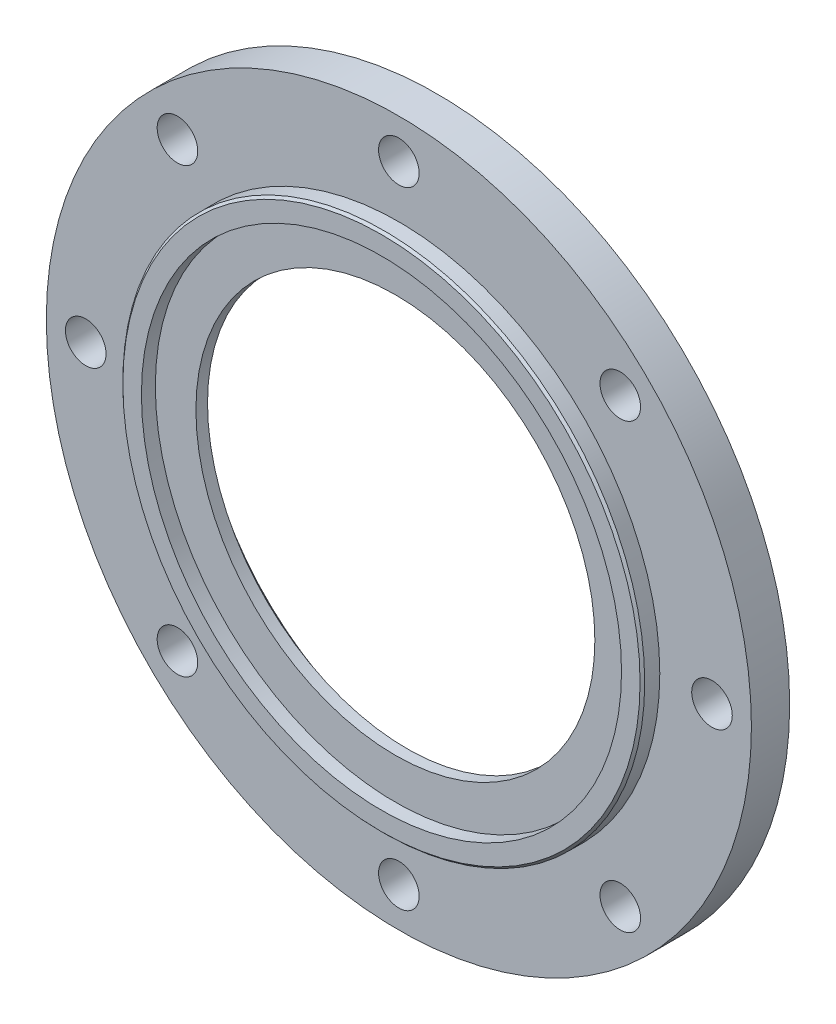
ISO-10303-21;
HEADER;
FILE_DESCRIPTION(('STEP AP214'),'2;1');
FILE_NAME('part.step','',(''),(''),'','','');
FILE_SCHEMA(('AUTOMOTIVE_DESIGN { 1 0 10303 214 1 1 1 1 }'));
ENDSEC;
DATA;
#1=APPLICATION_CONTEXT('core data for automotive mechanical design processes');
#2=APPLICATION_PROTOCOL_DEFINITION('international standard','automotive_design',2000,#1);
#3=PRODUCT_CONTEXT('',#1,'mechanical');
#4=PRODUCT('Part','Part','',(#3));
#5=PRODUCT_RELATED_PRODUCT_CATEGORY('part','',(#4));
#6=PRODUCT_DEFINITION_FORMATION('','',#4);
#7=PRODUCT_DEFINITION_CONTEXT('part definition',#1,'design');
#8=PRODUCT_DEFINITION('design','',#6,#7);
#9=PRODUCT_DEFINITION_SHAPE('','',#8);
#10=(LENGTH_UNIT() NAMED_UNIT(*) SI_UNIT(.MILLI.,.METRE.));
#11=(NAMED_UNIT(*) PLANE_ANGLE_UNIT() SI_UNIT($,.RADIAN.));
#12=(NAMED_UNIT(*) SI_UNIT($,.STERADIAN.) SOLID_ANGLE_UNIT());
#13=UNCERTAINTY_MEASURE_WITH_UNIT(LENGTH_MEASURE(1.E-05),#10,'distance_accuracy_value','');
#14=(GEOMETRIC_REPRESENTATION_CONTEXT(3) GLOBAL_UNCERTAINTY_ASSIGNED_CONTEXT((#13)) GLOBAL_UNIT_ASSIGNED_CONTEXT((#10,
#11,#12)) REPRESENTATION_CONTEXT('',''));
#15=CARTESIAN_POINT('',(0.,0.,0.));
#16=DIRECTION('',(0.,0.,1.));
#17=DIRECTION('',(1.,0.,0.));
#18=AXIS2_PLACEMENT_3D('',#15,#16,#17);
#19=CARTESIAN_POINT('',(0.,0.,24.));
#20=DIRECTION('',(0.,0.,-1.));
#21=DIRECTION('',(-1.,0.,0.));
#22=AXIS2_PLACEMENT_3D('',#19,#20,#21);
#23=CYLINDRICAL_SURFACE('',#22,86.);
#24=CARTESIAN_POINT('',(0.,0.,18.));
#25=DIRECTION('',(0.,0.,1.));
#26=DIRECTION('',(1.,0.,0.));
#27=AXIS2_PLACEMENT_3D('',#24,#25,#26);
#28=CIRCLE('',#27,86.);
#29=CARTESIAN_POINT('',(86.,0.,18.));
#30=VERTEX_POINT('',#29);
#31=EDGE_CURVE('E177',#30,#30,#28,.T.);
#32=ORIENTED_EDGE('',*,*,#31,.T.);
#33=EDGE_LOOP('',(#32));
#34=FACE_BOUND('',#33,.T.);
#35=CARTESIAN_POINT('',(0.,0.,13.));
#36=DIRECTION('',(0.,0.,-1.));
#37=DIRECTION('',(-1.,0.,0.));
#38=AXIS2_PLACEMENT_3D('',#35,#36,#37);
#39=CIRCLE('',#38,86.);
#40=CARTESIAN_POINT('',(-86.,0.,13.));
#41=VERTEX_POINT('',#40);
#42=EDGE_CURVE('E163',#41,#41,#39,.T.);
#43=ORIENTED_EDGE('',*,*,#42,.T.);
#44=EDGE_LOOP('',(#43));
#45=FACE_BOUND('',#44,.T.);
#46=ADVANCED_FACE('F49',(#34,#45),#23,.F.);
#47=CARTESIAN_POINT('',(0.,0.,24.));
#48=DIRECTION('',(0.,0.,1.));
#49=DIRECTION('',(1.,0.,0.));
#50=AXIS2_PLACEMENT_3D('',#47,#48,#49);
#51=PLANE('',#50);
#52=CARTESIAN_POINT('',(0.,0.,24.));
#53=DIRECTION('',(0.,0.,1.));
#54=DIRECTION('',(1.,0.,0.));
#55=AXIS2_PLACEMENT_3D('',#52,#53,#54);
#56=CIRCLE('',#55,111.5);
#57=CARTESIAN_POINT('',(111.5,0.,24.));
#58=VERTEX_POINT('',#57);
#59=EDGE_CURVE('E193',#58,#58,#56,.T.);
#60=ORIENTED_EDGE('',*,*,#59,.T.);
#61=EDGE_LOOP('',(#60));
#62=FACE_BOUND('',#61,.T.);
#63=CARTESIAN_POINT('',(0.,0.,24.));
#64=DIRECTION('',(0.,0.,1.));
#65=DIRECTION('',(1.,0.,0.));
#66=AXIS2_PLACEMENT_3D('',#63,#64,#65);
#67=CIRCLE('',#66,103.5);
#68=CARTESIAN_POINT('',(103.5,0.,24.));
#69=VERTEX_POINT('',#68);
#70=EDGE_CURVE('E168',#69,#69,#67,.T.);
#71=ORIENTED_EDGE('',*,*,#70,.F.);
#72=EDGE_LOOP('',(#71));
#73=FACE_BOUND('',#72,.T.);
#74=ADVANCED_FACE('F225',(#62,#73),#51,.T.);
#75=CARTESIAN_POINT('',(0.,0.,24.));
#76=DIRECTION('',(0.,0.,-1.));
#77=DIRECTION('',(-1.,0.,0.));
#78=AXIS2_PLACEMENT_3D('',#75,#76,#77);
#79=CYLINDRICAL_SURFACE('',#78,152.);
#80=CARTESIAN_POINT('',(0.,0.,0.));
#81=DIRECTION('',(0.,0.,1.));
#82=DIRECTION('',(1.,0.,0.));
#83=AXIS2_PLACEMENT_3D('',#80,#81,#82);
#84=CIRCLE('',#83,152.);
#85=CARTESIAN_POINT('',(152.,0.,0.));
#86=VERTEX_POINT('',#85);
#87=EDGE_CURVE('E189',#86,#86,#84,.T.);
#88=ORIENTED_EDGE('',*,*,#87,.T.);
#89=EDGE_LOOP('',(#88));
#90=FACE_BOUND('',#89,.T.);
#91=CARTESIAN_POINT('',(0.,0.,16.5));
#92=DIRECTION('',(0.,0.,1.));
#93=DIRECTION('',(1.,0.,0.));
#94=AXIS2_PLACEMENT_3D('',#91,#92,#93);
#95=CIRCLE('',#94,152.);
#96=CARTESIAN_POINT('',(152.,0.,16.5));
#97=VERTEX_POINT('',#96);
#98=EDGE_CURVE('E185',#97,#97,#95,.T.);
#99=ORIENTED_EDGE('',*,*,#98,.F.);
#100=EDGE_LOOP('',(#99));
#101=FACE_BOUND('',#100,.T.);
#102=ADVANCED_FACE('F231',(#90,#101),#79,.T.);
#103=CARTESIAN_POINT('',(0.,0.,0.));
#104=DIRECTION('',(0.,0.,1.));
#105=DIRECTION('',(1.,0.,0.));
#106=AXIS2_PLACEMENT_3D('',#103,#104,#105);
#107=PLANE('',#106);
#108=CARTESIAN_POINT('',(135.,-4.71349980743823E-13,0.));
#109=DIRECTION('',(0.,0.,-1.));
#110=DIRECTION('',(0.,1.,0.));
#111=AXIS2_PLACEMENT_3D('',#108,#109,#110);
#112=CIRCLE('',#111,8.75);
#113=CARTESIAN_POINT('',(135.,8.74999999999953,0.));
#114=VERTEX_POINT('',#113);
#115=EDGE_CURVE('E650',#114,#114,#112,.T.);
#116=ORIENTED_EDGE('',*,*,#115,.F.);
#117=EDGE_LOOP('',(#116));
#118=FACE_BOUND('',#117,.T.);
#119=CARTESIAN_POINT('',(95.4594154601834,-95.4594154601844,0.));
#120=DIRECTION('',(0.,0.,-1.));
#121=DIRECTION('',(0.707106781186551,0.707106781186544,0.));
#122=AXIS2_PLACEMENT_3D('',#119,#120,#121);
#123=CIRCLE('',#122,8.75);
#124=CARTESIAN_POINT('',(101.646599795566,-89.2722311248022,0.));
#125=VERTEX_POINT('',#124);
#126=EDGE_CURVE('E652',#125,#125,#123,.T.);
#127=ORIENTED_EDGE('',*,*,#126,.F.);
#128=EDGE_LOOP('',(#127));
#129=FACE_BOUND('',#128,.T.);
#130=CARTESIAN_POINT('',(0.,-135.,0.));
#131=DIRECTION('',(0.,0.,-1.));
#132=DIRECTION('',(1.,0.,0.));
#133=AXIS2_PLACEMENT_3D('',#130,#131,#132);
#134=CIRCLE('',#133,8.75);
#135=CARTESIAN_POINT('',(8.75,-135.,0.));
#136=VERTEX_POINT('',#135);
#137=EDGE_CURVE('E658',#136,#136,#134,.T.);
#138=ORIENTED_EDGE('',*,*,#137,.F.);
#139=EDGE_LOOP('',(#138));
#140=FACE_BOUND('',#139,.T.);
#141=CARTESIAN_POINT('',(-95.4594154601848,-95.4594154601831,0.));
#142=DIRECTION('',(0.,0.,-1.));
#143=DIRECTION('',(0.707106781186541,-0.707106781186554,0.));
#144=AXIS2_PLACEMENT_3D('',#141,#142,#143);
#145=CIRCLE('',#144,8.75);
#146=CARTESIAN_POINT('',(-89.2722311248025,-101.646599795565,0.));
#147=VERTEX_POINT('',#146);
#148=EDGE_CURVE('E666',#147,#147,#145,.T.);
#149=ORIENTED_EDGE('',*,*,#148,.F.);
#150=EDGE_LOOP('',(#149));
#151=FACE_BOUND('',#150,.T.);
#152=CARTESIAN_POINT('',(-135.,1.41404994223147E-12,0.));
#153=DIRECTION('',(0.,0.,-1.));
#154=DIRECTION('',(0.,-1.,0.));
#155=AXIS2_PLACEMENT_3D('',#152,#153,#154);
#156=CIRCLE('',#155,8.75);
#157=CARTESIAN_POINT('',(-135.,-8.74999999999859,0.));
#158=VERTEX_POINT('',#157);
#159=EDGE_CURVE('E669',#158,#158,#156,.T.);
#160=ORIENTED_EDGE('',*,*,#159,.F.);
#161=EDGE_LOOP('',(#160));
#162=FACE_BOUND('',#161,.T.);
#163=CARTESIAN_POINT('',(-95.4594154601828,95.4594154601851,0.));
#164=DIRECTION('',(0.,0.,-1.));
#165=DIRECTION('',(-0.707106781186556,-0.707106781186539,0.));
#166=AXIS2_PLACEMENT_3D('',#163,#164,#165);
#167=CIRCLE('',#166,8.75);
#168=CARTESIAN_POINT('',(-101.646599795565,89.2722311248029,0.));
#169=VERTEX_POINT('',#168);
#170=EDGE_CURVE('E661',#169,#169,#167,.T.);
#171=ORIENTED_EDGE('',*,*,#170,.F.);
#172=EDGE_LOOP('',(#171));
#173=FACE_BOUND('',#172,.T.);
#174=CARTESIAN_POINT('',(95.4594154601841,95.4594154601838,0.));
#175=DIRECTION('',(0.,0.,-1.));
#176=DIRECTION('',(-0.707106781186546,0.707106781186549,0.));
#177=AXIS2_PLACEMENT_3D('',#174,#175,#176);
#178=CIRCLE('',#177,8.75);
#179=CARTESIAN_POINT('',(89.2722311248018,101.646599795566,0.));
#180=VERTEX_POINT('',#179);
#181=EDGE_CURVE('E80',#180,#180,#178,.T.);
#182=ORIENTED_EDGE('',*,*,#181,.F.);
#183=EDGE_LOOP('',(#182));
#184=FACE_BOUND('',#183,.T.);
#185=CARTESIAN_POINT('',(0.,135.,0.));
#186=DIRECTION('',(0.,0.,-1.));
#187=DIRECTION('',(-1.,0.,0.));
#188=AXIS2_PLACEMENT_3D('',#185,#186,#187);
#189=CIRCLE('',#188,8.75);
#190=CARTESIAN_POINT('',(-8.75,135.,0.));
#191=VERTEX_POINT('',#190);
#192=EDGE_CURVE('E74',#191,#191,#189,.T.);
#193=ORIENTED_EDGE('',*,*,#192,.F.);
#194=EDGE_LOOP('',(#193));
#195=FACE_BOUND('',#194,.T.);
#196=CARTESIAN_POINT('',(0.,0.,0.));
#197=DIRECTION('',(0.,0.,-1.));
#198=DIRECTION('',(-1.,0.,0.));
#199=AXIS2_PLACEMENT_3D('',#196,#197,#198);
#200=CIRCLE('',#199,117.);
#201=CARTESIAN_POINT('',(-117.,0.,0.));
#202=VERTEX_POINT('',#201);
#203=EDGE_CURVE('E169',#202,#202,#200,.T.);
#204=ORIENTED_EDGE('',*,*,#203,.F.);
#205=EDGE_LOOP('',(#204));
#206=FACE_BOUND('',#205,.T.);
#207=ORIENTED_EDGE('',*,*,#87,.F.);
#208=EDGE_LOOP('',(#207));
#209=FACE_BOUND('',#208,.T.);
#210=ADVANCED_FACE('F238',(#118,#129,#140,#151,#162,#173,#184,#195,#206,#209),#107,.F.);
#211=CARTESIAN_POINT('',(0.,0.,16.5));
#212=DIRECTION('',(0.,0.,1.));
#213=DIRECTION('',(1.,0.,0.));
#214=AXIS2_PLACEMENT_3D('',#211,#212,#213);
#215=PLANE('',#214);
#216=CARTESIAN_POINT('',(135.,-4.71349980743823E-13,16.5));
#217=DIRECTION('',(0.,0.,1.));
#218=DIRECTION('',(1.,0.,0.));
#219=AXIS2_PLACEMENT_3D('',#216,#217,#218);
#220=CIRCLE('',#219,8.75);
#221=CARTESIAN_POINT('',(143.75,-4.71349980743823E-13,16.5));
#222=VERTEX_POINT('',#221);
#223=EDGE_CURVE('E54',#222,#222,#220,.T.);
#224=ORIENTED_EDGE('',*,*,#223,.F.);
#225=EDGE_LOOP('',(#224));
#226=FACE_BOUND('',#225,.T.);
#227=CARTESIAN_POINT('',(95.4594154601834,-95.4594154601844,16.5));
#228=DIRECTION('',(0.,0.,1.));
#229=DIRECTION('',(1.,0.,0.));
#230=AXIS2_PLACEMENT_3D('',#227,#228,#229);
#231=CIRCLE('',#230,8.75);
#232=CARTESIAN_POINT('',(104.209415460183,-95.4594154601844,16.5));
#233=VERTEX_POINT('',#232);
#234=EDGE_CURVE('E95',#233,#233,#231,.T.);
#235=ORIENTED_EDGE('',*,*,#234,.F.);
#236=EDGE_LOOP('',(#235));
#237=FACE_BOUND('',#236,.T.);
#238=CARTESIAN_POINT('',(0.,-135.,16.5));
#239=DIRECTION('',(0.,0.,1.));
#240=DIRECTION('',(1.,0.,0.));
#241=AXIS2_PLACEMENT_3D('',#238,#239,#240);
#242=CIRCLE('',#241,8.75);
#243=CARTESIAN_POINT('',(8.75,-135.,16.5));
#244=VERTEX_POINT('',#243);
#245=EDGE_CURVE('E92',#244,#244,#242,.T.);
#246=ORIENTED_EDGE('',*,*,#245,.F.);
#247=EDGE_LOOP('',(#246));
#248=FACE_BOUND('',#247,.T.);
#249=CARTESIAN_POINT('',(-95.4594154601848,-95.4594154601831,16.5));
#250=DIRECTION('',(0.,0.,1.));
#251=DIRECTION('',(1.,0.,0.));
#252=AXIS2_PLACEMENT_3D('',#249,#250,#251);
#253=CIRCLE('',#252,8.75);
#254=CARTESIAN_POINT('',(-86.7094154601847,-95.4594154601831,16.5));
#255=VERTEX_POINT('',#254);
#256=EDGE_CURVE('E88',#255,#255,#253,.T.);
#257=ORIENTED_EDGE('',*,*,#256,.F.);
#258=EDGE_LOOP('',(#257));
#259=FACE_BOUND('',#258,.T.);
#260=CARTESIAN_POINT('',(-135.,1.41404994223147E-12,16.5));
#261=DIRECTION('',(0.,0.,1.));
#262=DIRECTION('',(1.,0.,0.));
#263=AXIS2_PLACEMENT_3D('',#260,#261,#262);
#264=CIRCLE('',#263,8.75);
#265=CARTESIAN_POINT('',(-126.25,1.41404994223147E-12,16.5));
#266=VERTEX_POINT('',#265);
#267=EDGE_CURVE('E84',#266,#266,#264,.T.);
#268=ORIENTED_EDGE('',*,*,#267,.F.);
#269=EDGE_LOOP('',(#268));
#270=FACE_BOUND('',#269,.T.);
#271=CARTESIAN_POINT('',(-95.4594154601828,95.4594154601851,16.5));
#272=DIRECTION('',(0.,0.,1.));
#273=DIRECTION('',(1.,0.,0.));
#274=AXIS2_PLACEMENT_3D('',#271,#272,#273);
#275=CIRCLE('',#274,8.75);
#276=CARTESIAN_POINT('',(-86.7094154601828,95.4594154601851,16.5));
#277=VERTEX_POINT('',#276);
#278=EDGE_CURVE('E79',#277,#277,#275,.T.);
#279=ORIENTED_EDGE('',*,*,#278,.F.);
#280=EDGE_LOOP('',(#279));
#281=FACE_BOUND('',#280,.T.);
#282=CARTESIAN_POINT('',(95.4594154601841,95.4594154601838,16.5));
#283=DIRECTION('',(0.,0.,1.));
#284=DIRECTION('',(1.,0.,0.));
#285=AXIS2_PLACEMENT_3D('',#282,#283,#284);
#286=CIRCLE('',#285,8.75);
#287=CARTESIAN_POINT('',(104.209415460184,95.4594154601838,16.5));
#288=VERTEX_POINT('',#287);
#289=EDGE_CURVE('E75',#288,#288,#286,.T.);
#290=ORIENTED_EDGE('',*,*,#289,.F.);
#291=EDGE_LOOP('',(#290));
#292=FACE_BOUND('',#291,.T.);
#293=CARTESIAN_POINT('',(0.,135.,16.5));
#294=DIRECTION('',(0.,0.,1.));
#295=DIRECTION('',(1.,0.,0.));
#296=AXIS2_PLACEMENT_3D('',#293,#294,#295);
#297=CIRCLE('',#296,8.75);
#298=CARTESIAN_POINT('',(8.75,135.,16.5));
#299=VERTEX_POINT('',#298);
#300=EDGE_CURVE('E69',#299,#299,#297,.T.);
#301=ORIENTED_EDGE('',*,*,#300,.F.);
#302=EDGE_LOOP('',(#301));
#303=FACE_BOUND('',#302,.T.);
#304=CARTESIAN_POINT('',(0.,0.,16.5));
#305=DIRECTION('',(0.,0.,1.));
#306=DIRECTION('',(1.,0.,0.));
#307=AXIS2_PLACEMENT_3D('',#304,#305,#306);
#308=CIRCLE('',#307,112.5);
#309=CARTESIAN_POINT('',(112.5,0.,16.5));
#310=VERTEX_POINT('',#309);
#311=EDGE_CURVE('E181',#310,#310,#308,.T.);
#312=ORIENTED_EDGE('',*,*,#311,.F.);
#313=EDGE_LOOP('',(#312));
#314=FACE_BOUND('',#313,.T.);
#315=ORIENTED_EDGE('',*,*,#98,.T.);
#316=EDGE_LOOP('',(#315));
#317=FACE_BOUND('',#316,.T.);
#318=ADVANCED_FACE('F235',(#226,#237,#248,#259,#270,#281,#292,#303,#314,#317),#215,.T.);
#319=CARTESIAN_POINT('',(0.,0.,16.5));
#320=DIRECTION('',(0.,0.,1.));
#321=DIRECTION('',(1.,0.,0.));
#322=AXIS2_PLACEMENT_3D('',#319,#320,#321);
#323=CYLINDRICAL_SURFACE('',#322,112.5);
#324=CARTESIAN_POINT('',(0.,0.,22.9999999999999));
#325=DIRECTION('',(0.,0.,1.));
#326=DIRECTION('',(1.,0.,0.));
#327=AXIS2_PLACEMENT_3D('',#324,#325,#326);
#328=CIRCLE('',#327,112.5);
#329=CARTESIAN_POINT('',(112.5,0.,22.9999999999999));
#330=VERTEX_POINT('',#329);
#331=EDGE_CURVE('E65',#330,#330,#328,.F.);
#332=ORIENTED_EDGE('',*,*,#331,.T.);
#333=EDGE_LOOP('',(#332));
#334=FACE_BOUND('',#333,.T.);
#335=ORIENTED_EDGE('',*,*,#311,.T.);
#336=EDGE_LOOP('',(#335));
#337=FACE_BOUND('',#336,.T.);
#338=ADVANCED_FACE('F267',(#334,#337),#323,.T.);
#339=CARTESIAN_POINT('',(0.,0.,18.));
#340=DIRECTION('',(0.,0.,1.));
#341=DIRECTION('',(1.,0.,0.));
#342=AXIS2_PLACEMENT_3D('',#339,#340,#341);
#343=CYLINDRICAL_SURFACE('',#342,103.5);
#344=CARTESIAN_POINT('',(0.,0.,18.));
#345=DIRECTION('',(0.,0.,1.));
#346=DIRECTION('',(1.,0.,0.));
#347=AXIS2_PLACEMENT_3D('',#344,#345,#346);
#348=CIRCLE('',#347,103.5);
#349=CARTESIAN_POINT('',(103.5,0.,18.));
#350=VERTEX_POINT('',#349);
#351=EDGE_CURVE('E173',#350,#350,#348,.T.);
#352=ORIENTED_EDGE('',*,*,#351,.F.);
#353=EDGE_LOOP('',(#352));
#354=FACE_BOUND('',#353,.T.);
#355=ORIENTED_EDGE('',*,*,#70,.T.);
#356=EDGE_LOOP('',(#355));
#357=FACE_BOUND('',#356,.T.);
#358=ADVANCED_FACE('F257',(#354,#357),#343,.F.);
#359=CARTESIAN_POINT('',(0.,0.,18.));
#360=DIRECTION('',(0.,0.,1.));
#361=DIRECTION('',(1.,0.,0.));
#362=AXIS2_PLACEMENT_3D('',#359,#360,#361);
#363=PLANE('',#362);
#364=ORIENTED_EDGE('',*,*,#31,.F.);
#365=EDGE_LOOP('',(#364));
#366=FACE_BOUND('',#365,.T.);
#367=ORIENTED_EDGE('',*,*,#351,.T.);
#368=EDGE_LOOP('',(#367));
#369=FACE_BOUND('',#368,.T.);
#370=ADVANCED_FACE('F249',(#366,#369),#363,.T.);
#371=CARTESIAN_POINT('',(0.,0.,24.));
#372=DIRECTION('',(0.,0.,-1.));
#373=DIRECTION('',(-1.,0.,0.));
#374=AXIS2_PLACEMENT_3D('',#371,#372,#373);
#375=CONICAL_SURFACE('',#374,111.5,0.785398163397448);
#376=ORIENTED_EDGE('',*,*,#331,.F.);
#377=EDGE_LOOP('',(#376));
#378=FACE_BOUND('',#377,.T.);
#379=ORIENTED_EDGE('',*,*,#59,.F.);
#380=EDGE_LOOP('',(#379));
#381=FACE_BOUND('',#380,.T.);
#382=ADVANCED_FACE('F245',(#378,#381),#375,.T.);
#383=CARTESIAN_POINT('',(0.,0.,2.));
#384=DIRECTION('',(0.,0.,-1.));
#385=DIRECTION('',(-1.,0.,0.));
#386=AXIS2_PLACEMENT_3D('',#383,#384,#385);
#387=CYLINDRICAL_SURFACE('',#386,117.);
#388=CARTESIAN_POINT('',(0.,0.,2.));
#389=DIRECTION('',(0.,0.,-1.));
#390=DIRECTION('',(-1.,0.,0.));
#391=AXIS2_PLACEMENT_3D('',#388,#389,#390);
#392=CIRCLE('',#391,117.);
#393=CARTESIAN_POINT('',(-117.,0.,2.));
#394=VERTEX_POINT('',#393);
#395=EDGE_CURVE('E164',#394,#394,#392,.T.);
#396=ORIENTED_EDGE('',*,*,#395,.F.);
#397=EDGE_LOOP('',(#396));
#398=FACE_BOUND('',#397,.T.);
#399=ORIENTED_EDGE('',*,*,#203,.T.);
#400=EDGE_LOOP('',(#399));
#401=FACE_BOUND('',#400,.T.);
#402=ADVANCED_FACE('F221',(#398,#401),#387,.F.);
#403=CARTESIAN_POINT('',(0.,0.,2.));
#404=DIRECTION('',(0.,0.,-1.));
#405=DIRECTION('',(-1.,0.,0.));
#406=AXIS2_PLACEMENT_3D('',#403,#404,#405);
#407=PLANE('',#406);
#408=CARTESIAN_POINT('',(-93.0977309068265,53.7500000000011,2.));
#409=DIRECTION('',(0.,0.,-1.));
#410=DIRECTION('',(-0.50000000000001,-0.866025403784433,0.));
#411=AXIS2_PLACEMENT_3D('',#408,#409,#410);
#412=CIRCLE('',#411,4.);
#413=CARTESIAN_POINT('',(-95.0977309068266,50.2858983848634,2.));
#414=VERTEX_POINT('',#413);
#415=EDGE_CURVE('E73',#414,#414,#412,.T.);
#416=ORIENTED_EDGE('',*,*,#415,.F.);
#417=EDGE_LOOP('',(#416));
#418=FACE_BOUND('',#417,.T.);
#419=CARTESIAN_POINT('',(-93.0977309068276,-53.7499999999991,2.));
#420=DIRECTION('',(0.,0.,-1.));
#421=DIRECTION('',(0.499999999999992,-0.866025403784443,0.));
#422=AXIS2_PLACEMENT_3D('',#419,#420,#421);
#423=CIRCLE('',#422,4.);
#424=CARTESIAN_POINT('',(-91.0977309068277,-57.2141016151369,2.));
#425=VERTEX_POINT('',#424);
#426=EDGE_CURVE('E133',#425,#425,#423,.T.);
#427=ORIENTED_EDGE('',*,*,#426,.F.);
#428=EDGE_LOOP('',(#427));
#429=FACE_BOUND('',#428,.T.);
#430=CARTESIAN_POINT('',(0.,-107.5,2.));
#431=DIRECTION('',(0.,0.,-1.));
#432=DIRECTION('',(1.,0.,0.));
#433=AXIS2_PLACEMENT_3D('',#430,#431,#432);
#434=CIRCLE('',#433,4.);
#435=CARTESIAN_POINT('',(4.,-107.5,2.));
#436=VERTEX_POINT('',#435);
#437=EDGE_CURVE('E125',#436,#436,#434,.T.);
#438=ORIENTED_EDGE('',*,*,#437,.F.);
#439=EDGE_LOOP('',(#438));
#440=FACE_BOUND('',#439,.T.);
#441=CARTESIAN_POINT('',(93.0977309068269,-53.7500000000004,2.));
#442=DIRECTION('',(0.,0.,-1.));
#443=DIRECTION('',(0.500000000000004,0.866025403784436,0.));
#444=AXIS2_PLACEMENT_3D('',#441,#442,#443);
#445=CIRCLE('',#444,4.);
#446=CARTESIAN_POINT('',(95.0977309068269,-50.2858983848627,2.));
#447=VERTEX_POINT('',#446);
#448=EDGE_CURVE('E117',#447,#447,#445,.T.);
#449=ORIENTED_EDGE('',*,*,#448,.F.);
#450=EDGE_LOOP('',(#449));
#451=FACE_BOUND('',#450,.T.);
#452=CARTESIAN_POINT('',(93.0977309068273,53.7499999999998,2.));
#453=DIRECTION('',(0.,0.,-1.));
#454=DIRECTION('',(-0.499999999999998,0.86602540378444,0.));
#455=AXIS2_PLACEMENT_3D('',#452,#453,#454);
#456=CIRCLE('',#455,4.);
#457=CARTESIAN_POINT('',(91.0977309068273,57.2141016151375,2.));
#458=VERTEX_POINT('',#457);
#459=EDGE_CURVE('E116',#458,#458,#456,.T.);
#460=ORIENTED_EDGE('',*,*,#459,.F.);
#461=EDGE_LOOP('',(#460));
#462=FACE_BOUND('',#461,.T.);
#463=CARTESIAN_POINT('',(0.,107.5,2.));
#464=DIRECTION('',(0.,0.,-1.));
#465=DIRECTION('',(-1.,0.,0.));
#466=AXIS2_PLACEMENT_3D('',#463,#464,#465);
#467=CIRCLE('',#466,4.);
#468=CARTESIAN_POINT('',(-4.,107.5,2.));
#469=VERTEX_POINT('',#468);
#470=EDGE_CURVE('E148',#469,#469,#467,.T.);
#471=ORIENTED_EDGE('',*,*,#470,.F.);
#472=EDGE_LOOP('',(#471));
#473=FACE_BOUND('',#472,.T.);
#474=CARTESIAN_POINT('',(0.,0.,2.));
#475=DIRECTION('',(0.,0.,-1.));
#476=DIRECTION('',(-1.,0.,0.));
#477=AXIS2_PLACEMENT_3D('',#474,#475,#476);
#478=CIRCLE('',#477,101.);
#479=CARTESIAN_POINT('',(-101.,0.,2.));
#480=VERTEX_POINT('',#479);
#481=EDGE_CURVE('E11',#480,#480,#478,.F.);
#482=ORIENTED_EDGE('',*,*,#481,.T.);
#483=EDGE_LOOP('',(#482));
#484=FACE_BOUND('',#483,.T.);
#485=ORIENTED_EDGE('',*,*,#395,.T.);
#486=EDGE_LOOP('',(#485));
#487=FACE_BOUND('',#486,.T.);
#488=ADVANCED_FACE('F215',(#418,#429,#440,#451,#462,#473,#484,#487),#407,.T.);
#489=CARTESIAN_POINT('',(0.,0.,13.));
#490=DIRECTION('',(0.,0.,-1.));
#491=DIRECTION('',(-1.,0.,0.));
#492=AXIS2_PLACEMENT_3D('',#489,#490,#491);
#493=CYLINDRICAL_SURFACE('',#492,100.);
#494=CARTESIAN_POINT('',(0.,0.,3.00000000000004));
#495=DIRECTION('',(0.,0.,-1.));
#496=DIRECTION('',(-1.,0.,0.));
#497=AXIS2_PLACEMENT_3D('',#494,#495,#496);
#498=CIRCLE('',#497,100.);
#499=CARTESIAN_POINT('',(-100.,0.,3.00000000000004));
#500=VERTEX_POINT('',#499);
#501=EDGE_CURVE('E59',#500,#500,#498,.T.);
#502=ORIENTED_EDGE('',*,*,#501,.T.);
#503=EDGE_LOOP('',(#502));
#504=FACE_BOUND('',#503,.T.);
#505=CARTESIAN_POINT('',(0.,0.,13.));
#506=DIRECTION('',(0.,0.,-1.));
#507=DIRECTION('',(-1.,0.,0.));
#508=AXIS2_PLACEMENT_3D('',#505,#506,#507);
#509=CIRCLE('',#508,100.);
#510=CARTESIAN_POINT('',(-100.,0.,13.));
#511=VERTEX_POINT('',#510);
#512=EDGE_CURVE('E156',#511,#511,#509,.T.);
#513=ORIENTED_EDGE('',*,*,#512,.F.);
#514=EDGE_LOOP('',(#513));
#515=FACE_BOUND('',#514,.T.);
#516=ADVANCED_FACE('F210',(#504,#515),#493,.F.);
#517=CARTESIAN_POINT('',(0.,0.,13.));
#518=DIRECTION('',(0.,0.,-1.));
#519=DIRECTION('',(-1.,0.,0.));
#520=AXIS2_PLACEMENT_3D('',#517,#518,#519);
#521=PLANE('',#520);
#522=ORIENTED_EDGE('',*,*,#42,.F.);
#523=EDGE_LOOP('',(#522));
#524=FACE_BOUND('',#523,.T.);
#525=ORIENTED_EDGE('',*,*,#512,.T.);
#526=EDGE_LOOP('',(#525));
#527=FACE_BOUND('',#526,.T.);
#528=ADVANCED_FACE('F207',(#524,#527),#521,.T.);
#529=CARTESIAN_POINT('',(0.,0.,3.00000000000004));
#530=DIRECTION('',(0.,0.,-1.));
#531=DIRECTION('',(-1.,0.,0.));
#532=AXIS2_PLACEMENT_3D('',#529,#530,#531);
#533=CONICAL_SURFACE('',#532,100.,0.785398163397441);
#534=ORIENTED_EDGE('',*,*,#481,.F.);
#535=EDGE_LOOP('',(#534));
#536=FACE_BOUND('',#535,.T.);
#537=ORIENTED_EDGE('',*,*,#501,.F.);
#538=EDGE_LOOP('',(#537));
#539=FACE_BOUND('',#538,.T.);
#540=ADVANCED_FACE('F52',(#536,#539),#533,.F.);
#541=CARTESIAN_POINT('',(0.,107.5,13.));
#542=DIRECTION('',(0.,0.,-1.));
#543=DIRECTION('',(-1.,0.,0.));
#544=AXIS2_PLACEMENT_3D('',#541,#542,#543);
#545=CYLINDRICAL_SURFACE('',#544,4.);
#546=CARTESIAN_POINT('',(0.,107.5,13.));
#547=DIRECTION('',(0.,0.,-1.));
#548=DIRECTION('',(-1.,0.,0.));
#549=AXIS2_PLACEMENT_3D('',#546,#547,#548);
#550=CIRCLE('',#549,4.);
#551=CARTESIAN_POINT('',(-4.,107.5,13.));
#552=VERTEX_POINT('',#551);
#553=EDGE_CURVE('E152',#552,#552,#550,.T.);
#554=ORIENTED_EDGE('',*,*,#553,.F.);
#555=EDGE_LOOP('',(#554));
#556=FACE_BOUND('',#555,.T.);
#557=ORIENTED_EDGE('',*,*,#470,.T.);
#558=EDGE_LOOP('',(#557));
#559=FACE_BOUND('',#558,.T.);
#560=ADVANCED_FACE('F357',(#556,#559),#545,.F.);
#561=CARTESIAN_POINT('',(0.,107.5,13.));
#562=DIRECTION('',(0.,0.,-1.));
#563=DIRECTION('',(-1.,0.,0.));
#564=AXIS2_PLACEMENT_3D('',#561,#562,#563);
#565=PLANE('',#564);
#566=ORIENTED_EDGE('',*,*,#553,.T.);
#567=EDGE_LOOP('',(#566));
#568=FACE_BOUND('',#567,.T.);
#569=ADVANCED_FACE('F353',(#568),#565,.T.);
#570=CARTESIAN_POINT('',(93.0977309068273,53.7499999999998,13.));
#571=DIRECTION('',(0.,0.,-1.));
#572=DIRECTION('',(-1.,0.,0.));
#573=AXIS2_PLACEMENT_3D('',#570,#571,#572);
#574=CYLINDRICAL_SURFACE('',#573,4.);
#575=CARTESIAN_POINT('',(93.0977309068273,53.7499999999998,13.));
#576=DIRECTION('',(0.,0.,-1.));
#577=DIRECTION('',(-0.499999999999998,0.86602540378444,0.));
#578=AXIS2_PLACEMENT_3D('',#575,#576,#577);
#579=CIRCLE('',#578,4.);
#580=CARTESIAN_POINT('',(91.0977309068273,57.2141016151375,13.));
#581=VERTEX_POINT('',#580);
#582=EDGE_CURVE('E144',#581,#581,#579,.T.);
#583=ORIENTED_EDGE('',*,*,#582,.F.);
#584=EDGE_LOOP('',(#583));
#585=FACE_BOUND('',#584,.T.);
#586=ORIENTED_EDGE('',*,*,#459,.T.);
#587=EDGE_LOOP('',(#586));
#588=FACE_BOUND('',#587,.T.);
#589=ADVANCED_FACE('F349',(#585,#588),#574,.F.);
#590=CARTESIAN_POINT('',(93.0977309068273,53.7499999999998,13.));
#591=DIRECTION('',(0.,0.,-1.));
#592=DIRECTION('',(-0.499999999999998,0.86602540378444,0.));
#593=AXIS2_PLACEMENT_3D('',#590,#591,#592);
#594=PLANE('',#593);
#595=ORIENTED_EDGE('',*,*,#582,.T.);
#596=EDGE_LOOP('',(#595));
#597=FACE_BOUND('',#596,.T.);
#598=ADVANCED_FACE('F327',(#597),#594,.T.);
#599=CARTESIAN_POINT('',(93.0977309068269,-53.7500000000004,13.));
#600=DIRECTION('',(0.,0.,-1.));
#601=DIRECTION('',(-1.,0.,0.));
#602=AXIS2_PLACEMENT_3D('',#599,#600,#601);
#603=CYLINDRICAL_SURFACE('',#602,4.);
#604=CARTESIAN_POINT('',(93.0977309068269,-53.7500000000004,13.));
#605=DIRECTION('',(0.,0.,-1.));
#606=DIRECTION('',(0.500000000000004,0.866025403784436,0.));
#607=AXIS2_PLACEMENT_3D('',#604,#605,#606);
#608=CIRCLE('',#607,4.);
#609=CARTESIAN_POINT('',(95.0977309068269,-50.2858983848627,13.));
#610=VERTEX_POINT('',#609);
#611=EDGE_CURVE('E112',#610,#610,#608,.T.);
#612=ORIENTED_EDGE('',*,*,#611,.F.);
#613=EDGE_LOOP('',(#612));
#614=FACE_BOUND('',#613,.T.);
#615=ORIENTED_EDGE('',*,*,#448,.T.);
#616=EDGE_LOOP('',(#615));
#617=FACE_BOUND('',#616,.T.);
#618=ADVANCED_FACE('F323',(#614,#617),#603,.F.);
#619=CARTESIAN_POINT('',(93.0977309068269,-53.7500000000004,13.));
#620=DIRECTION('',(0.,0.,-1.));
#621=DIRECTION('',(0.500000000000004,0.866025403784436,0.));
#622=AXIS2_PLACEMENT_3D('',#619,#620,#621);
#623=PLANE('',#622);
#624=ORIENTED_EDGE('',*,*,#611,.T.);
#625=EDGE_LOOP('',(#624));
#626=FACE_BOUND('',#625,.T.);
#627=ADVANCED_FACE('F319',(#626),#623,.T.);
#628=CARTESIAN_POINT('',(0.,-107.5,13.));
#629=DIRECTION('',(0.,0.,-1.));
#630=DIRECTION('',(-1.,0.,0.));
#631=AXIS2_PLACEMENT_3D('',#628,#629,#630);
#632=CYLINDRICAL_SURFACE('',#631,4.);
#633=CARTESIAN_POINT('',(0.,-107.5,13.));
#634=DIRECTION('',(0.,0.,-1.));
#635=DIRECTION('',(1.,0.,0.));
#636=AXIS2_PLACEMENT_3D('',#633,#634,#635);
#637=CIRCLE('',#636,4.);
#638=CARTESIAN_POINT('',(4.,-107.5,13.));
#639=VERTEX_POINT('',#638);
#640=EDGE_CURVE('E121',#639,#639,#637,.T.);
#641=ORIENTED_EDGE('',*,*,#640,.F.);
#642=EDGE_LOOP('',(#641));
#643=FACE_BOUND('',#642,.T.);
#644=ORIENTED_EDGE('',*,*,#437,.T.);
#645=EDGE_LOOP('',(#644));
#646=FACE_BOUND('',#645,.T.);
#647=ADVANCED_FACE('F322',(#643,#646),#632,.F.);
#648=CARTESIAN_POINT('',(0.,-107.5,13.));
#649=DIRECTION('',(0.,0.,-1.));
#650=DIRECTION('',(1.,0.,0.));
#651=AXIS2_PLACEMENT_3D('',#648,#649,#650);
#652=PLANE('',#651);
#653=ORIENTED_EDGE('',*,*,#640,.T.);
#654=EDGE_LOOP('',(#653));
#655=FACE_BOUND('',#654,.T.);
#656=ADVANCED_FACE('F329',(#655),#652,.T.);
#657=CARTESIAN_POINT('',(-93.0977309068276,-53.7499999999991,13.));
#658=DIRECTION('',(0.,0.,-1.));
#659=DIRECTION('',(-1.,0.,0.));
#660=AXIS2_PLACEMENT_3D('',#657,#658,#659);
#661=CYLINDRICAL_SURFACE('',#660,4.);
#662=CARTESIAN_POINT('',(-93.0977309068276,-53.7499999999991,13.));
#663=DIRECTION('',(0.,0.,-1.));
#664=DIRECTION('',(0.499999999999992,-0.866025403784443,0.));
#665=AXIS2_PLACEMENT_3D('',#662,#663,#664);
#666=CIRCLE('',#665,4.);
#667=CARTESIAN_POINT('',(-91.0977309068277,-57.2141016151369,13.));
#668=VERTEX_POINT('',#667);
#669=EDGE_CURVE('E129',#668,#668,#666,.T.);
#670=ORIENTED_EDGE('',*,*,#669,.F.);
#671=EDGE_LOOP('',(#670));
#672=FACE_BOUND('',#671,.T.);
#673=ORIENTED_EDGE('',*,*,#426,.T.);
#674=EDGE_LOOP('',(#673));
#675=FACE_BOUND('',#674,.T.);
#676=ADVANCED_FACE('F332',(#672,#675),#661,.F.);
#677=CARTESIAN_POINT('',(-93.0977309068276,-53.7499999999991,13.));
#678=DIRECTION('',(0.,0.,-1.));
#679=DIRECTION('',(0.499999999999992,-0.866025403784443,0.));
#680=AXIS2_PLACEMENT_3D('',#677,#678,#679);
#681=PLANE('',#680);
#682=ORIENTED_EDGE('',*,*,#669,.T.);
#683=EDGE_LOOP('',(#682));
#684=FACE_BOUND('',#683,.T.);
#685=ADVANCED_FACE('F337',(#684),#681,.T.);
#686=CARTESIAN_POINT('',(-93.0977309068265,53.7500000000011,13.));
#687=DIRECTION('',(0.,0.,-1.));
#688=DIRECTION('',(-1.,0.,0.));
#689=AXIS2_PLACEMENT_3D('',#686,#687,#688);
#690=CYLINDRICAL_SURFACE('',#689,4.);
#691=CARTESIAN_POINT('',(-93.0977309068265,53.7500000000011,13.));
#692=DIRECTION('',(0.,0.,-1.));
#693=DIRECTION('',(-0.50000000000001,-0.866025403784433,0.));
#694=AXIS2_PLACEMENT_3D('',#691,#692,#693);
#695=CIRCLE('',#694,4.);
#696=CARTESIAN_POINT('',(-95.0977309068266,50.2858983848634,13.));
#697=VERTEX_POINT('',#696);
#698=EDGE_CURVE('E137',#697,#697,#695,.T.);
#699=ORIENTED_EDGE('',*,*,#698,.F.);
#700=EDGE_LOOP('',(#699));
#701=FACE_BOUND('',#700,.T.);
#702=ORIENTED_EDGE('',*,*,#415,.T.);
#703=EDGE_LOOP('',(#702));
#704=FACE_BOUND('',#703,.T.);
#705=ADVANCED_FACE('F314',(#701,#704),#690,.F.);
#706=CARTESIAN_POINT('',(-93.0977309068265,53.7500000000011,13.));
#707=DIRECTION('',(0.,0.,-1.));
#708=DIRECTION('',(-0.50000000000001,-0.866025403784433,0.));
#709=AXIS2_PLACEMENT_3D('',#706,#707,#708);
#710=PLANE('',#709);
#711=ORIENTED_EDGE('',*,*,#698,.T.);
#712=EDGE_LOOP('',(#711));
#713=FACE_BOUND('',#712,.T.);
#714=ADVANCED_FACE('F305',(#713),#710,.T.);
#715=CARTESIAN_POINT('',(0.,135.,24.));
#716=DIRECTION('',(0.,0.,-1.));
#717=DIRECTION('',(-1.,0.,0.));
#718=AXIS2_PLACEMENT_3D('',#715,#716,#717);
#719=CYLINDRICAL_SURFACE('',#718,8.75);
#720=ORIENTED_EDGE('',*,*,#300,.T.);
#721=EDGE_LOOP('',(#720));
#722=FACE_BOUND('',#721,.T.);
#723=ORIENTED_EDGE('',*,*,#192,.T.);
#724=EDGE_LOOP('',(#723));
#725=FACE_BOUND('',#724,.T.);
#726=ADVANCED_FACE('F302',(#722,#725),#719,.F.);
#727=CARTESIAN_POINT('',(95.4594154601841,95.4594154601838,24.));
#728=DIRECTION('',(0.,0.,-1.));
#729=DIRECTION('',(-1.,0.,0.));
#730=AXIS2_PLACEMENT_3D('',#727,#728,#729);
#731=CYLINDRICAL_SURFACE('',#730,8.75);
#732=ORIENTED_EDGE('',*,*,#289,.T.);
#733=EDGE_LOOP('',(#732));
#734=FACE_BOUND('',#733,.T.);
#735=ORIENTED_EDGE('',*,*,#181,.T.);
#736=EDGE_LOOP('',(#735));
#737=FACE_BOUND('',#736,.T.);
#738=ADVANCED_FACE('F304',(#734,#737),#731,.F.);
#739=CARTESIAN_POINT('',(-95.4594154601828,95.4594154601851,24.));
#740=DIRECTION('',(0.,0.,-1.));
#741=DIRECTION('',(-1.,0.,0.));
#742=AXIS2_PLACEMENT_3D('',#739,#740,#741);
#743=CYLINDRICAL_SURFACE('',#742,8.75);
#744=ORIENTED_EDGE('',*,*,#278,.T.);
#745=EDGE_LOOP('',(#744));
#746=FACE_BOUND('',#745,.T.);
#747=ORIENTED_EDGE('',*,*,#170,.T.);
#748=EDGE_LOOP('',(#747));
#749=FACE_BOUND('',#748,.T.);
#750=ADVANCED_FACE('F311',(#746,#749),#743,.F.);
#751=CARTESIAN_POINT('',(-135.,1.41404994223147E-12,24.));
#752=DIRECTION('',(0.,0.,-1.));
#753=DIRECTION('',(-1.,0.,0.));
#754=AXIS2_PLACEMENT_3D('',#751,#752,#753);
#755=CYLINDRICAL_SURFACE('',#754,8.75);
#756=ORIENTED_EDGE('',*,*,#267,.T.);
#757=EDGE_LOOP('',(#756));
#758=FACE_BOUND('',#757,.T.);
#759=ORIENTED_EDGE('',*,*,#159,.T.);
#760=EDGE_LOOP('',(#759));
#761=FACE_BOUND('',#760,.T.);
#762=ADVANCED_FACE('F582',(#758,#761),#755,.F.);
#763=CARTESIAN_POINT('',(-95.4594154601848,-95.4594154601831,24.));
#764=DIRECTION('',(0.,0.,-1.));
#765=DIRECTION('',(-1.,0.,0.));
#766=AXIS2_PLACEMENT_3D('',#763,#764,#765);
#767=CYLINDRICAL_SURFACE('',#766,8.75);
#768=ORIENTED_EDGE('',*,*,#256,.T.);
#769=EDGE_LOOP('',(#768));
#770=FACE_BOUND('',#769,.T.);
#771=ORIENTED_EDGE('',*,*,#148,.T.);
#772=EDGE_LOOP('',(#771));
#773=FACE_BOUND('',#772,.T.);
#774=ADVANCED_FACE('F592',(#770,#773),#767,.F.);
#775=CARTESIAN_POINT('',(0.,-135.,24.));
#776=DIRECTION('',(0.,0.,-1.));
#777=DIRECTION('',(-1.,0.,0.));
#778=AXIS2_PLACEMENT_3D('',#775,#776,#777);
#779=CYLINDRICAL_SURFACE('',#778,8.75);
#780=ORIENTED_EDGE('',*,*,#245,.T.);
#781=EDGE_LOOP('',(#780));
#782=FACE_BOUND('',#781,.T.);
#783=ORIENTED_EDGE('',*,*,#137,.T.);
#784=EDGE_LOOP('',(#783));
#785=FACE_BOUND('',#784,.T.);
#786=ADVANCED_FACE('F602',(#782,#785),#779,.F.);
#787=CARTESIAN_POINT('',(95.4594154601834,-95.4594154601844,24.));
#788=DIRECTION('',(0.,0.,-1.));
#789=DIRECTION('',(-1.,0.,0.));
#790=AXIS2_PLACEMENT_3D('',#787,#788,#789);
#791=CYLINDRICAL_SURFACE('',#790,8.75);
#792=ORIENTED_EDGE('',*,*,#234,.T.);
#793=EDGE_LOOP('',(#792));
#794=FACE_BOUND('',#793,.T.);
#795=ORIENTED_EDGE('',*,*,#126,.T.);
#796=EDGE_LOOP('',(#795));
#797=FACE_BOUND('',#796,.T.);
#798=ADVANCED_FACE('F611',(#794,#797),#791,.F.);
#799=CARTESIAN_POINT('',(135.,-4.71349980743823E-13,24.));
#800=DIRECTION('',(0.,0.,-1.));
#801=DIRECTION('',(-1.,0.,0.));
#802=AXIS2_PLACEMENT_3D('',#799,#800,#801);
#803=CYLINDRICAL_SURFACE('',#802,8.75);
#804=ORIENTED_EDGE('',*,*,#223,.T.);
#805=EDGE_LOOP('',(#804));
#806=FACE_BOUND('',#805,.T.);
#807=ORIENTED_EDGE('',*,*,#115,.T.);
#808=EDGE_LOOP('',(#807));
#809=FACE_BOUND('',#808,.T.);
#810=ADVANCED_FACE('F621',(#806,#809),#803,.F.);
#811=CLOSED_SHELL('',(#46,#74,#102,#210,#318,#338,#358,#370,#382,#402,#488,#516,#528,#540,#560,
#569,#589,#598,#618,#627,#647,#656,#676,#685,#705,#714,#726,#738,#750,#762,#774,#786,#798,#810));
#812=MANIFOLD_SOLID_BREP('B2',#811);
#813=ADVANCED_BREP_SHAPE_REPRESENTATION('',(#18,#812),#14);
#814=SHAPE_DEFINITION_REPRESENTATION(#9,#813);
ENDSEC;
END-ISO-10303-21;
